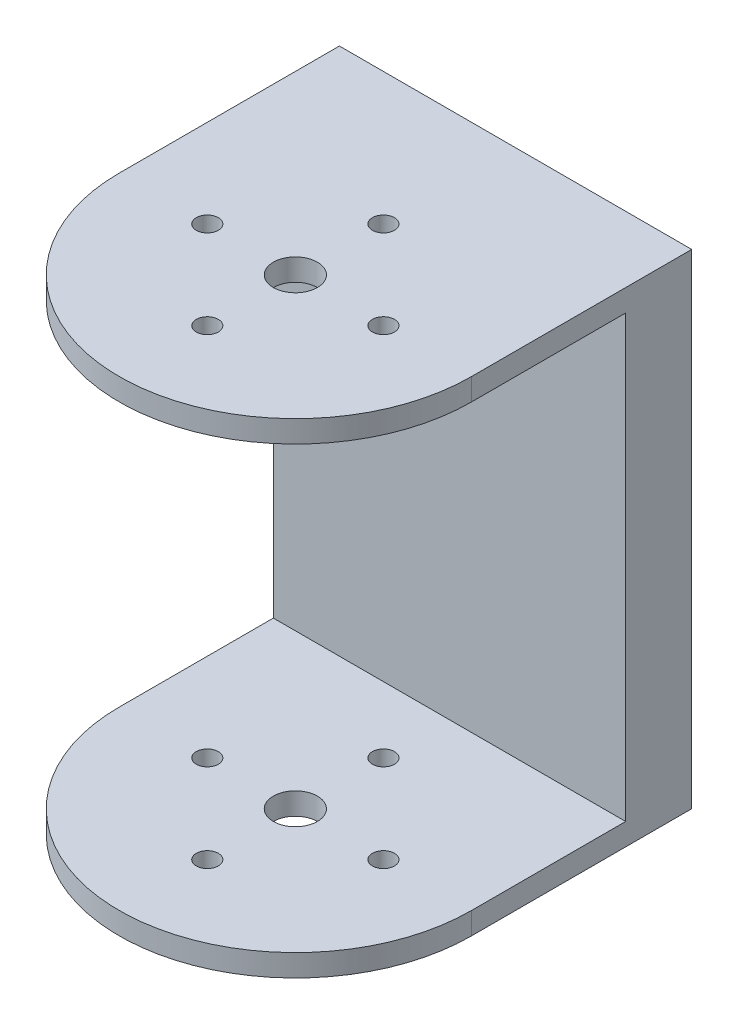
ISO-10303-21;
HEADER;
FILE_DESCRIPTION(('STEP AP214'),'2;1');
FILE_NAME('part.step','',(''),(''),'','','');
FILE_SCHEMA(('AUTOMOTIVE_DESIGN { 1 0 10303 214 1 1 1 1 }'));
ENDSEC;
DATA;
#1=APPLICATION_CONTEXT('core data for automotive mechanical design processes');
#2=APPLICATION_PROTOCOL_DEFINITION('international standard','automotive_design',2000,#1);
#3=PRODUCT_CONTEXT('',#1,'mechanical');
#4=PRODUCT('Part','Part','',(#3));
#5=PRODUCT_RELATED_PRODUCT_CATEGORY('part','',(#4));
#6=PRODUCT_DEFINITION_FORMATION('','',#4);
#7=PRODUCT_DEFINITION_CONTEXT('part definition',#1,'design');
#8=PRODUCT_DEFINITION('design','',#6,#7);
#9=PRODUCT_DEFINITION_SHAPE('','',#8);
#10=(LENGTH_UNIT() NAMED_UNIT(*) SI_UNIT(.MILLI.,.METRE.));
#11=(NAMED_UNIT(*) PLANE_ANGLE_UNIT() SI_UNIT($,.RADIAN.));
#12=(NAMED_UNIT(*) SI_UNIT($,.STERADIAN.) SOLID_ANGLE_UNIT());
#13=UNCERTAINTY_MEASURE_WITH_UNIT(LENGTH_MEASURE(1.E-05),#10,'distance_accuracy_value','');
#14=(GEOMETRIC_REPRESENTATION_CONTEXT(3) GLOBAL_UNCERTAINTY_ASSIGNED_CONTEXT((#13)) GLOBAL_UNIT_ASSIGNED_CONTEXT((#10,
#11,#12)) REPRESENTATION_CONTEXT('',''));
#15=CARTESIAN_POINT('',(0.,0.,0.));
#16=DIRECTION('',(0.,0.,1.));
#17=DIRECTION('',(1.,0.,0.));
#18=AXIS2_PLACEMENT_3D('',#15,#16,#17);
#19=CARTESIAN_POINT('',(2.25414240564596E-13,44.,0.));
#20=DIRECTION('',(0.,-1.,0.));
#21=DIRECTION('',(0.,0.,-1.));
#22=AXIS2_PLACEMENT_3D('',#19,#20,#21);
#23=CYLINDRICAL_SURFACE('',#22,16.);
#24=DIRECTION('',(0.,-1.,0.));
#25=VECTOR('',#24,1.);
#26=CARTESIAN_POINT('',(16.,44.,0.));
#27=LINE('',#26,#25);
#28=CARTESIAN_POINT('',(16.,1.99999999999999,0.));
#29=VERTEX_POINT('',#28);
#30=CARTESIAN_POINT('',(16.,0.,0.));
#31=VERTEX_POINT('',#30);
#32=EDGE_CURVE('E50',#29,#31,#27,.T.);
#33=ORIENTED_EDGE('',*,*,#32,.F.);
#34=CARTESIAN_POINT('',(2.25414240564596E-13,1.99999999999999,0.));
#35=DIRECTION('',(0.,-1.,0.));
#36=DIRECTION('',(0.,0.,-1.));
#37=AXIS2_PLACEMENT_3D('',#34,#35,#36);
#38=CIRCLE('',#37,16.);
#39=CARTESIAN_POINT('',(-16.,1.99999999999999,0.));
#40=VERTEX_POINT('',#39);
#41=EDGE_CURVE('E172',#29,#40,#38,.T.);
#42=ORIENTED_EDGE('',*,*,#41,.T.);
#43=DIRECTION('',(0.,-1.,0.));
#44=VECTOR('',#43,1.);
#45=CARTESIAN_POINT('',(-16.,44.,0.));
#46=LINE('',#45,#44);
#47=CARTESIAN_POINT('',(-16.,0.,0.));
#48=VERTEX_POINT('',#47);
#49=EDGE_CURVE('E89',#40,#48,#46,.T.);
#50=ORIENTED_EDGE('',*,*,#49,.T.);
#51=CARTESIAN_POINT('',(2.25414240564596E-13,0.,0.));
#52=DIRECTION('',(0.,1.,0.));
#53=DIRECTION('',(0.,0.,1.));
#54=AXIS2_PLACEMENT_3D('',#51,#52,#53);
#55=CIRCLE('',#54,16.);
#56=EDGE_CURVE('E202',#48,#31,#55,.T.);
#57=ORIENTED_EDGE('',*,*,#56,.T.);
#58=EDGE_LOOP('',(#33,#42,#50,#57));
#59=FACE_BOUND('',#58,.T.);
#60=ADVANCED_FACE('F41',(#59),#23,.T.);
#61=CARTESIAN_POINT('',(2.25414240564596E-13,44.,0.));
#62=DIRECTION('',(0.,-1.,0.));
#63=DIRECTION('',(0.,0.,-1.));
#64=AXIS2_PLACEMENT_3D('',#61,#62,#63);
#65=CYLINDRICAL_SURFACE('',#64,2.);
#66=CARTESIAN_POINT('',(2.25414240564596E-13,1.99999999999999,0.));
#67=DIRECTION('',(0.,-1.,0.));
#68=DIRECTION('',(0.,0.,-1.));
#69=AXIS2_PLACEMENT_3D('',#66,#67,#68);
#70=CIRCLE('',#69,2.);
#71=CARTESIAN_POINT('',(2.25414240564596E-13,1.99999999999999,-2.));
#72=VERTEX_POINT('',#71);
#73=EDGE_CURVE('E169',#72,#72,#70,.T.);
#74=ORIENTED_EDGE('',*,*,#73,.F.);
#75=EDGE_LOOP('',(#74));
#76=FACE_BOUND('',#75,.T.);
#77=CARTESIAN_POINT('',(2.25414240564596E-13,0.,0.));
#78=DIRECTION('',(0.,1.,0.));
#79=DIRECTION('',(0.,0.,1.));
#80=AXIS2_PLACEMENT_3D('',#77,#78,#79);
#81=CIRCLE('',#80,2.);
#82=CARTESIAN_POINT('',(2.25414240564596E-13,0.,2.));
#83=VERTEX_POINT('',#82);
#84=EDGE_CURVE('E196',#83,#83,#81,.T.);
#85=ORIENTED_EDGE('',*,*,#84,.F.);
#86=EDGE_LOOP('',(#85));
#87=FACE_BOUND('',#86,.T.);
#88=ADVANCED_FACE('F255',(#76,#87),#65,.F.);
#89=CARTESIAN_POINT('',(0.,44.,-8.));
#90=DIRECTION('',(0.,-1.,0.));
#91=DIRECTION('',(0.,0.,-1.));
#92=AXIS2_PLACEMENT_3D('',#89,#90,#91);
#93=CYLINDRICAL_SURFACE('',#92,1.);
#94=CARTESIAN_POINT('',(0.,1.99999999999999,-8.));
#95=DIRECTION('',(0.,-1.,0.));
#96=DIRECTION('',(0.,0.,-1.));
#97=AXIS2_PLACEMENT_3D('',#94,#95,#96);
#98=CIRCLE('',#97,1.);
#99=CARTESIAN_POINT('',(0.,1.99999999999999,-9.));
#100=VERTEX_POINT('',#99);
#101=EDGE_CURVE('E166',#100,#100,#98,.T.);
#102=ORIENTED_EDGE('',*,*,#101,.F.);
#103=EDGE_LOOP('',(#102));
#104=FACE_BOUND('',#103,.T.);
#105=CARTESIAN_POINT('',(0.,0.,-8.));
#106=DIRECTION('',(0.,1.,0.));
#107=DIRECTION('',(0.,0.,1.));
#108=AXIS2_PLACEMENT_3D('',#105,#106,#107);
#109=CIRCLE('',#108,1.);
#110=CARTESIAN_POINT('',(0.,0.,-7.));
#111=VERTEX_POINT('',#110);
#112=EDGE_CURVE('E190',#111,#111,#109,.T.);
#113=ORIENTED_EDGE('',*,*,#112,.F.);
#114=EDGE_LOOP('',(#113));
#115=FACE_BOUND('',#114,.T.);
#116=ADVANCED_FACE('F259',(#104,#115),#93,.F.);
#117=CARTESIAN_POINT('',(8.,44.,0.));
#118=DIRECTION('',(0.,-1.,0.));
#119=DIRECTION('',(0.,0.,-1.));
#120=AXIS2_PLACEMENT_3D('',#117,#118,#119);
#121=CYLINDRICAL_SURFACE('',#120,1.00000000000003);
#122=CARTESIAN_POINT('',(8.,1.99999999999999,0.));
#123=DIRECTION('',(0.,-1.,0.));
#124=DIRECTION('',(0.,0.,-1.));
#125=AXIS2_PLACEMENT_3D('',#122,#123,#124);
#126=CIRCLE('',#125,1.00000000000003);
#127=CARTESIAN_POINT('',(8.,1.99999999999999,-1.00000000000003));
#128=VERTEX_POINT('',#127);
#129=EDGE_CURVE('E163',#128,#128,#126,.T.);
#130=ORIENTED_EDGE('',*,*,#129,.F.);
#131=EDGE_LOOP('',(#130));
#132=FACE_BOUND('',#131,.T.);
#133=CARTESIAN_POINT('',(8.,0.,0.));
#134=DIRECTION('',(0.,1.,0.));
#135=DIRECTION('',(0.,0.,1.));
#136=AXIS2_PLACEMENT_3D('',#133,#134,#135);
#137=CIRCLE('',#136,1.00000000000003);
#138=CARTESIAN_POINT('',(8.,0.,1.00000000000003));
#139=VERTEX_POINT('',#138);
#140=EDGE_CURVE('E184',#139,#139,#137,.T.);
#141=ORIENTED_EDGE('',*,*,#140,.F.);
#142=EDGE_LOOP('',(#141));
#143=FACE_BOUND('',#142,.T.);
#144=ADVANCED_FACE('F292',(#132,#143),#121,.F.);
#145=CARTESIAN_POINT('',(0.,44.,8.));
#146=DIRECTION('',(0.,-1.,0.));
#147=DIRECTION('',(0.,0.,-1.));
#148=AXIS2_PLACEMENT_3D('',#145,#146,#147);
#149=CYLINDRICAL_SURFACE('',#148,1.00000000000005);
#150=CARTESIAN_POINT('',(0.,1.99999999999999,8.));
#151=DIRECTION('',(0.,-1.,0.));
#152=DIRECTION('',(0.,0.,-1.));
#153=AXIS2_PLACEMENT_3D('',#150,#151,#152);
#154=CIRCLE('',#153,1.00000000000005);
#155=CARTESIAN_POINT('',(0.,1.99999999999999,6.99999999999995));
#156=VERTEX_POINT('',#155);
#157=EDGE_CURVE('E160',#156,#156,#154,.T.);
#158=ORIENTED_EDGE('',*,*,#157,.F.);
#159=EDGE_LOOP('',(#158));
#160=FACE_BOUND('',#159,.T.);
#161=CARTESIAN_POINT('',(0.,0.,8.));
#162=DIRECTION('',(0.,1.,0.));
#163=DIRECTION('',(0.,0.,1.));
#164=AXIS2_PLACEMENT_3D('',#161,#162,#163);
#165=CIRCLE('',#164,1.00000000000005);
#166=CARTESIAN_POINT('',(0.,0.,9.00000000000006));
#167=VERTEX_POINT('',#166);
#168=EDGE_CURVE('E178',#167,#167,#165,.T.);
#169=ORIENTED_EDGE('',*,*,#168,.F.);
#170=EDGE_LOOP('',(#169));
#171=FACE_BOUND('',#170,.T.);
#172=ADVANCED_FACE('F249',(#160,#171),#149,.F.);
#173=CARTESIAN_POINT('',(-8.,44.,0.));
#174=DIRECTION('',(0.,-1.,0.));
#175=DIRECTION('',(0.,0.,-1.));
#176=AXIS2_PLACEMENT_3D('',#173,#174,#175);
#177=CYLINDRICAL_SURFACE('',#176,1.00000000000008);
#178=CARTESIAN_POINT('',(-8.,1.99999999999999,0.));
#179=DIRECTION('',(0.,-1.,0.));
#180=DIRECTION('',(0.,0.,-1.));
#181=AXIS2_PLACEMENT_3D('',#178,#179,#180);
#182=CIRCLE('',#181,1.00000000000008);
#183=CARTESIAN_POINT('',(-8.,1.99999999999999,-1.00000000000008));
#184=VERTEX_POINT('',#183);
#185=EDGE_CURVE('E45',#184,#184,#182,.T.);
#186=ORIENTED_EDGE('',*,*,#185,.F.);
#187=EDGE_LOOP('',(#186));
#188=FACE_BOUND('',#187,.T.);
#189=CARTESIAN_POINT('',(-8.,0.,0.));
#190=DIRECTION('',(0.,1.,0.));
#191=DIRECTION('',(0.,0.,1.));
#192=AXIS2_PLACEMENT_3D('',#189,#190,#191);
#193=CIRCLE('',#192,1.00000000000008);
#194=CARTESIAN_POINT('',(-8.,0.,1.00000000000008));
#195=VERTEX_POINT('',#194);
#196=EDGE_CURVE('E174',#195,#195,#193,.T.);
#197=ORIENTED_EDGE('',*,*,#196,.F.);
#198=EDGE_LOOP('',(#197));
#199=FACE_BOUND('',#198,.T.);
#200=ADVANCED_FACE('F235',(#188,#199),#177,.F.);
#201=CARTESIAN_POINT('',(2.25414240564596E-13,44.,0.));
#202=DIRECTION('',(0.,1.,0.));
#203=DIRECTION('',(0.,0.,1.));
#204=AXIS2_PLACEMENT_3D('',#201,#202,#203);
#205=PLANE('',#204);
#206=CARTESIAN_POINT('',(0.,44.,8.));
#207=DIRECTION('',(0.,1.,0.));
#208=DIRECTION('',(0.,0.,1.));
#209=AXIS2_PLACEMENT_3D('',#206,#207,#208);
#210=CIRCLE('',#209,1.00000000000005);
#211=CARTESIAN_POINT('',(0.,44.,9.00000000000006));
#212=VERTEX_POINT('',#211);
#213=EDGE_CURVE('E181',#212,#212,#210,.T.);
#214=ORIENTED_EDGE('',*,*,#213,.F.);
#215=EDGE_LOOP('',(#214));
#216=FACE_BOUND('',#215,.T.);
#217=CARTESIAN_POINT('',(0.,44.,-8.));
#218=DIRECTION('',(0.,1.,0.));
#219=DIRECTION('',(0.,0.,1.));
#220=AXIS2_PLACEMENT_3D('',#217,#218,#219);
#221=CIRCLE('',#220,1.);
#222=CARTESIAN_POINT('',(0.,44.,-7.));
#223=VERTEX_POINT('',#222);
#224=EDGE_CURVE('E193',#223,#223,#221,.T.);
#225=ORIENTED_EDGE('',*,*,#224,.F.);
#226=EDGE_LOOP('',(#225));
#227=FACE_BOUND('',#226,.T.);
#228=CARTESIAN_POINT('',(2.25414240564596E-13,44.,0.));
#229=DIRECTION('',(0.,1.,0.));
#230=DIRECTION('',(0.,0.,1.));
#231=AXIS2_PLACEMENT_3D('',#228,#229,#230);
#232=CIRCLE('',#231,16.);
#233=CARTESIAN_POINT('',(-16.,44.,0.));
#234=VERTEX_POINT('',#233);
#235=CARTESIAN_POINT('',(16.,44.,0.));
#236=VERTEX_POINT('',#235);
#237=EDGE_CURVE('E205',#234,#236,#232,.T.);
#238=ORIENTED_EDGE('',*,*,#237,.T.);
#239=DIRECTION('',(0.,0.,-1.));
#240=VECTOR('',#239,1.);
#241=CARTESIAN_POINT('',(16.,44.,-20.));
#242=LINE('',#241,#240);
#243=CARTESIAN_POINT('',(16.,44.,-20.));
#244=VERTEX_POINT('',#243);
#245=EDGE_CURVE('E96',#236,#244,#242,.T.);
#246=ORIENTED_EDGE('',*,*,#245,.T.);
#247=DIRECTION('',(-1.,0.,0.));
#248=VECTOR('',#247,1.);
#249=CARTESIAN_POINT('',(-16.,44.,-20.));
#250=LINE('',#249,#248);
#251=CARTESIAN_POINT('',(-16.,44.,-20.));
#252=VERTEX_POINT('',#251);
#253=EDGE_CURVE('E209',#244,#252,#250,.T.);
#254=ORIENTED_EDGE('',*,*,#253,.T.);
#255=DIRECTION('',(0.,0.,1.));
#256=VECTOR('',#255,1.);
#257=CARTESIAN_POINT('',(-16.,44.,0.));
#258=LINE('',#257,#256);
#259=EDGE_CURVE('E67',#252,#234,#258,.T.);
#260=ORIENTED_EDGE('',*,*,#259,.T.);
#261=EDGE_LOOP('',(#238,#246,#254,#260));
#262=FACE_BOUND('',#261,.T.);
#263=CARTESIAN_POINT('',(2.25414240564596E-13,44.,0.));
#264=DIRECTION('',(0.,1.,0.));
#265=DIRECTION('',(0.,0.,1.));
#266=AXIS2_PLACEMENT_3D('',#263,#264,#265);
#267=CIRCLE('',#266,2.);
#268=CARTESIAN_POINT('',(2.25414240564596E-13,44.,2.));
#269=VERTEX_POINT('',#268);
#270=EDGE_CURVE('E199',#269,#269,#267,.T.);
#271=ORIENTED_EDGE('',*,*,#270,.F.);
#272=EDGE_LOOP('',(#271));
#273=FACE_BOUND('',#272,.T.);
#274=CARTESIAN_POINT('',(8.,44.,0.));
#275=DIRECTION('',(0.,1.,0.));
#276=DIRECTION('',(0.,0.,1.));
#277=AXIS2_PLACEMENT_3D('',#274,#275,#276);
#278=CIRCLE('',#277,1.00000000000003);
#279=CARTESIAN_POINT('',(8.,44.,1.00000000000003));
#280=VERTEX_POINT('',#279);
#281=EDGE_CURVE('E187',#280,#280,#278,.T.);
#282=ORIENTED_EDGE('',*,*,#281,.F.);
#283=EDGE_LOOP('',(#282));
#284=FACE_BOUND('',#283,.T.);
#285=CARTESIAN_POINT('',(-8.,44.,0.));
#286=DIRECTION('',(0.,1.,0.));
#287=DIRECTION('',(0.,0.,1.));
#288=AXIS2_PLACEMENT_3D('',#285,#286,#287);
#289=CIRCLE('',#288,1.00000000000008);
#290=CARTESIAN_POINT('',(-8.,44.,1.00000000000008));
#291=VERTEX_POINT('',#290);
#292=EDGE_CURVE('E175',#291,#291,#289,.T.);
#293=ORIENTED_EDGE('',*,*,#292,.F.);
#294=EDGE_LOOP('',(#293));
#295=FACE_BOUND('',#294,.T.);
#296=ADVANCED_FACE('F238',(#216,#227,#262,#273,#284,#295),#205,.T.);
#297=CARTESIAN_POINT('',(2.25414240564596E-13,0.,0.));
#298=DIRECTION('',(0.,1.,0.));
#299=DIRECTION('',(0.,0.,1.));
#300=AXIS2_PLACEMENT_3D('',#297,#298,#299);
#301=PLANE('',#300);
#302=ORIENTED_EDGE('',*,*,#56,.F.);
#303=DIRECTION('',(0.,0.,1.));
#304=VECTOR('',#303,1.);
#305=CARTESIAN_POINT('',(-16.,0.,0.));
#306=LINE('',#305,#304);
#307=CARTESIAN_POINT('',(-16.,0.,-20.));
#308=VERTEX_POINT('',#307);
#309=EDGE_CURVE('E207',#308,#48,#306,.T.);
#310=ORIENTED_EDGE('',*,*,#309,.F.);
#311=DIRECTION('',(-1.,0.,0.));
#312=VECTOR('',#311,1.);
#313=CARTESIAN_POINT('',(-16.,0.,-20.));
#314=LINE('',#313,#312);
#315=CARTESIAN_POINT('',(16.,0.,-20.));
#316=VERTEX_POINT('',#315);
#317=EDGE_CURVE('E215',#316,#308,#314,.T.);
#318=ORIENTED_EDGE('',*,*,#317,.F.);
#319=DIRECTION('',(0.,0.,-1.));
#320=VECTOR('',#319,1.);
#321=CARTESIAN_POINT('',(16.,0.,-20.));
#322=LINE('',#321,#320);
#323=EDGE_CURVE('E213',#31,#316,#322,.T.);
#324=ORIENTED_EDGE('',*,*,#323,.F.);
#325=EDGE_LOOP('',(#302,#310,#318,#324));
#326=FACE_BOUND('',#325,.T.);
#327=ORIENTED_EDGE('',*,*,#84,.T.);
#328=EDGE_LOOP('',(#327));
#329=FACE_BOUND('',#328,.T.);
#330=ORIENTED_EDGE('',*,*,#112,.T.);
#331=EDGE_LOOP('',(#330));
#332=FACE_BOUND('',#331,.T.);
#333=ORIENTED_EDGE('',*,*,#140,.T.);
#334=EDGE_LOOP('',(#333));
#335=FACE_BOUND('',#334,.T.);
#336=ORIENTED_EDGE('',*,*,#168,.T.);
#337=EDGE_LOOP('',(#336));
#338=FACE_BOUND('',#337,.T.);
#339=ORIENTED_EDGE('',*,*,#196,.T.);
#340=EDGE_LOOP('',(#339));
#341=FACE_BOUND('',#340,.T.);
#342=ADVANCED_FACE('F240',(#326,#329,#332,#335,#338,#341),#301,.F.);
#343=CARTESIAN_POINT('',(2.25414240564596E-13,42.,0.));
#344=DIRECTION('',(0.,1.,0.));
#345=DIRECTION('',(0.,0.,1.));
#346=AXIS2_PLACEMENT_3D('',#343,#344,#345);
#347=CIRCLE('',#346,16.);
#348=CARTESIAN_POINT('',(-16.,42.,0.));
#349=VERTEX_POINT('',#348);
#350=CARTESIAN_POINT('',(16.,42.,0.));
#351=VERTEX_POINT('',#350);
#352=EDGE_CURVE('E58',#349,#351,#347,.T.);
#353=ORIENTED_EDGE('',*,*,#352,.T.);
#354=EDGE_CURVE('E11',#236,#351,#27,.T.);
#355=ORIENTED_EDGE('',*,*,#354,.F.);
#356=ORIENTED_EDGE('',*,*,#237,.F.);
#357=EDGE_CURVE('E218',#234,#349,#46,.T.);
#358=ORIENTED_EDGE('',*,*,#357,.T.);
#359=EDGE_LOOP('',(#353,#355,#356,#358));
#360=FACE_BOUND('',#359,.T.);
#361=ADVANCED_FACE('F43',(#360),#23,.T.);
#362=CARTESIAN_POINT('',(16.,44.,-20.));
#363=DIRECTION('',(-1.,0.,0.));
#364=DIRECTION('',(0.,0.,1.));
#365=AXIS2_PLACEMENT_3D('',#362,#363,#364);
#366=PLANE('',#365);
#367=DIRECTION('',(0.,1.,0.));
#368=VECTOR('',#367,1.);
#369=CARTESIAN_POINT('',(16.,42.,-14.));
#370=LINE('',#369,#368);
#371=CARTESIAN_POINT('',(16.,1.99999999999999,-14.));
#372=VERTEX_POINT('',#371);
#373=CARTESIAN_POINT('',(16.,42.,-14.));
#374=VERTEX_POINT('',#373);
#375=EDGE_CURVE('E125',#372,#374,#370,.T.);
#376=ORIENTED_EDGE('',*,*,#375,.F.);
#377=DIRECTION('',(0.,0.,-1.));
#378=VECTOR('',#377,1.);
#379=CARTESIAN_POINT('',(16.,1.99999999999999,16.));
#380=LINE('',#379,#378);
#381=EDGE_CURVE('E137',#29,#372,#380,.T.);
#382=ORIENTED_EDGE('',*,*,#381,.F.);
#383=ORIENTED_EDGE('',*,*,#32,.T.);
#384=ORIENTED_EDGE('',*,*,#323,.T.);
#385=DIRECTION('',(0.,-1.,0.));
#386=VECTOR('',#385,1.);
#387=CARTESIAN_POINT('',(16.,44.,-20.));
#388=LINE('',#387,#386);
#389=EDGE_CURVE('E223',#244,#316,#388,.T.);
#390=ORIENTED_EDGE('',*,*,#389,.F.);
#391=ORIENTED_EDGE('',*,*,#245,.F.);
#392=ORIENTED_EDGE('',*,*,#354,.T.);
#393=DIRECTION('',(0.,0.,1.));
#394=VECTOR('',#393,1.);
#395=CARTESIAN_POINT('',(16.,42.,16.));
#396=LINE('',#395,#394);
#397=EDGE_CURVE('E139',#374,#351,#396,.T.);
#398=ORIENTED_EDGE('',*,*,#397,.F.);
#399=EDGE_LOOP('',(#376,#382,#383,#384,#390,#391,#392,#398));
#400=FACE_BOUND('',#399,.T.);
#401=ADVANCED_FACE('F264',(#400),#366,.F.);
#402=CARTESIAN_POINT('',(-16.,44.,-20.));
#403=DIRECTION('',(0.,0.,1.));
#404=DIRECTION('',(1.,0.,0.));
#405=AXIS2_PLACEMENT_3D('',#402,#403,#404);
#406=PLANE('',#405);
#407=ORIENTED_EDGE('',*,*,#317,.T.);
#408=DIRECTION('',(0.,-1.,0.));
#409=VECTOR('',#408,1.);
#410=CARTESIAN_POINT('',(-16.,44.,-20.));
#411=LINE('',#410,#409);
#412=EDGE_CURVE('E220',#252,#308,#411,.T.);
#413=ORIENTED_EDGE('',*,*,#412,.F.);
#414=ORIENTED_EDGE('',*,*,#253,.F.);
#415=ORIENTED_EDGE('',*,*,#389,.T.);
#416=EDGE_LOOP('',(#407,#413,#414,#415));
#417=FACE_BOUND('',#416,.T.);
#418=ADVANCED_FACE('F269',(#417),#406,.F.);
#419=CARTESIAN_POINT('',(-16.,44.,0.));
#420=DIRECTION('',(1.,0.,0.));
#421=DIRECTION('',(0.,0.,-1.));
#422=AXIS2_PLACEMENT_3D('',#419,#420,#421);
#423=PLANE('',#422);
#424=ORIENTED_EDGE('',*,*,#49,.F.);
#425=DIRECTION('',(0.,0.,-1.));
#426=VECTOR('',#425,1.);
#427=CARTESIAN_POINT('',(-16.,1.99999999999999,16.));
#428=LINE('',#427,#426);
#429=CARTESIAN_POINT('',(-16.,1.99999999999999,-14.));
#430=VERTEX_POINT('',#429);
#431=EDGE_CURVE('E128',#40,#430,#428,.T.);
#432=ORIENTED_EDGE('',*,*,#431,.T.);
#433=DIRECTION('',(0.,1.,0.));
#434=VECTOR('',#433,1.);
#435=CARTESIAN_POINT('',(-16.,42.,-14.));
#436=LINE('',#435,#434);
#437=CARTESIAN_POINT('',(-16.,42.,-14.));
#438=VERTEX_POINT('',#437);
#439=EDGE_CURVE('E122',#430,#438,#436,.T.);
#440=ORIENTED_EDGE('',*,*,#439,.T.);
#441=DIRECTION('',(0.,0.,1.));
#442=VECTOR('',#441,1.);
#443=CARTESIAN_POINT('',(-16.,42.,16.));
#444=LINE('',#443,#442);
#445=EDGE_CURVE('E130',#438,#349,#444,.T.);
#446=ORIENTED_EDGE('',*,*,#445,.T.);
#447=ORIENTED_EDGE('',*,*,#357,.F.);
#448=ORIENTED_EDGE('',*,*,#259,.F.);
#449=ORIENTED_EDGE('',*,*,#412,.T.);
#450=ORIENTED_EDGE('',*,*,#309,.T.);
#451=EDGE_LOOP('',(#424,#432,#440,#446,#447,#448,#449,#450));
#452=FACE_BOUND('',#451,.T.);
#453=ADVANCED_FACE('F135',(#452),#423,.F.);
#454=CARTESIAN_POINT('',(2.25414240564596E-13,42.,0.));
#455=DIRECTION('',(0.,1.,0.));
#456=DIRECTION('',(0.,0.,1.));
#457=AXIS2_PLACEMENT_3D('',#454,#455,#456);
#458=CIRCLE('',#457,2.);
#459=CARTESIAN_POINT('',(2.25414240564596E-13,42.,2.));
#460=VERTEX_POINT('',#459);
#461=EDGE_CURVE('E156',#460,#460,#458,.T.);
#462=ORIENTED_EDGE('',*,*,#461,.F.);
#463=EDGE_LOOP('',(#462));
#464=FACE_BOUND('',#463,.T.);
#465=ORIENTED_EDGE('',*,*,#270,.T.);
#466=EDGE_LOOP('',(#465));
#467=FACE_BOUND('',#466,.T.);
#468=ADVANCED_FACE('F261',(#464,#467),#65,.F.);
#469=CARTESIAN_POINT('',(0.,42.,-8.));
#470=DIRECTION('',(0.,1.,0.));
#471=DIRECTION('',(0.,0.,1.));
#472=AXIS2_PLACEMENT_3D('',#469,#470,#471);
#473=CIRCLE('',#472,1.);
#474=CARTESIAN_POINT('',(0.,42.,-7.));
#475=VERTEX_POINT('',#474);
#476=EDGE_CURVE('E153',#475,#475,#473,.T.);
#477=ORIENTED_EDGE('',*,*,#476,.F.);
#478=EDGE_LOOP('',(#477));
#479=FACE_BOUND('',#478,.T.);
#480=ORIENTED_EDGE('',*,*,#224,.T.);
#481=EDGE_LOOP('',(#480));
#482=FACE_BOUND('',#481,.T.);
#483=ADVANCED_FACE('F289',(#479,#482),#93,.F.);
#484=CARTESIAN_POINT('',(8.,42.,0.));
#485=DIRECTION('',(0.,1.,0.));
#486=DIRECTION('',(0.,0.,1.));
#487=AXIS2_PLACEMENT_3D('',#484,#485,#486);
#488=CIRCLE('',#487,1.00000000000003);
#489=CARTESIAN_POINT('',(8.,42.,1.00000000000003));
#490=VERTEX_POINT('',#489);
#491=EDGE_CURVE('E150',#490,#490,#488,.T.);
#492=ORIENTED_EDGE('',*,*,#491,.F.);
#493=EDGE_LOOP('',(#492));
#494=FACE_BOUND('',#493,.T.);
#495=ORIENTED_EDGE('',*,*,#281,.T.);
#496=EDGE_LOOP('',(#495));
#497=FACE_BOUND('',#496,.T.);
#498=ADVANCED_FACE('F287',(#494,#497),#121,.F.);
#499=CARTESIAN_POINT('',(0.,42.,8.));
#500=DIRECTION('',(0.,1.,0.));
#501=DIRECTION('',(0.,0.,1.));
#502=AXIS2_PLACEMENT_3D('',#499,#500,#501);
#503=CIRCLE('',#502,1.00000000000005);
#504=CARTESIAN_POINT('',(0.,42.,9.00000000000006));
#505=VERTEX_POINT('',#504);
#506=EDGE_CURVE('E147',#505,#505,#503,.T.);
#507=ORIENTED_EDGE('',*,*,#506,.F.);
#508=EDGE_LOOP('',(#507));
#509=FACE_BOUND('',#508,.T.);
#510=ORIENTED_EDGE('',*,*,#213,.T.);
#511=EDGE_LOOP('',(#510));
#512=FACE_BOUND('',#511,.T.);
#513=ADVANCED_FACE('F233',(#509,#512),#149,.F.);
#514=CARTESIAN_POINT('',(-8.,42.,0.));
#515=DIRECTION('',(0.,1.,0.));
#516=DIRECTION('',(0.,0.,1.));
#517=AXIS2_PLACEMENT_3D('',#514,#515,#516);
#518=CIRCLE('',#517,1.00000000000008);
#519=CARTESIAN_POINT('',(-8.,42.,1.00000000000008));
#520=VERTEX_POINT('',#519);
#521=EDGE_CURVE('E145',#520,#520,#518,.T.);
#522=ORIENTED_EDGE('',*,*,#521,.F.);
#523=EDGE_LOOP('',(#522));
#524=FACE_BOUND('',#523,.T.);
#525=ORIENTED_EDGE('',*,*,#292,.T.);
#526=EDGE_LOOP('',(#525));
#527=FACE_BOUND('',#526,.T.);
#528=ADVANCED_FACE('F229',(#524,#527),#177,.F.);
#529=CARTESIAN_POINT('',(-16.,1.99999999999999,16.));
#530=DIRECTION('',(0.,-1.,0.));
#531=DIRECTION('',(0.,0.,-1.));
#532=AXIS2_PLACEMENT_3D('',#529,#530,#531);
#533=PLANE('',#532);
#534=ORIENTED_EDGE('',*,*,#73,.T.);
#535=EDGE_LOOP('',(#534));
#536=FACE_BOUND('',#535,.T.);
#537=ORIENTED_EDGE('',*,*,#101,.T.);
#538=EDGE_LOOP('',(#537));
#539=FACE_BOUND('',#538,.T.);
#540=ORIENTED_EDGE('',*,*,#129,.T.);
#541=EDGE_LOOP('',(#540));
#542=FACE_BOUND('',#541,.T.);
#543=ORIENTED_EDGE('',*,*,#157,.T.);
#544=EDGE_LOOP('',(#543));
#545=FACE_BOUND('',#544,.T.);
#546=ORIENTED_EDGE('',*,*,#185,.T.);
#547=EDGE_LOOP('',(#546));
#548=FACE_BOUND('',#547,.T.);
#549=ORIENTED_EDGE('',*,*,#381,.T.);
#550=DIRECTION('',(1.,0.,0.));
#551=VECTOR('',#550,1.);
#552=CARTESIAN_POINT('',(-16.,1.99999999999999,-14.));
#553=LINE('',#552,#551);
#554=EDGE_CURVE('E127',#430,#372,#553,.T.);
#555=ORIENTED_EDGE('',*,*,#554,.F.);
#556=ORIENTED_EDGE('',*,*,#431,.F.);
#557=ORIENTED_EDGE('',*,*,#41,.F.);
#558=EDGE_LOOP('',(#549,#555,#556,#557));
#559=FACE_BOUND('',#558,.T.);
#560=ADVANCED_FACE('F232',(#536,#539,#542,#545,#548,#559),#533,.F.);
#561=CARTESIAN_POINT('',(-16.,42.,16.));
#562=DIRECTION('',(0.,1.,0.));
#563=DIRECTION('',(0.,0.,1.));
#564=AXIS2_PLACEMENT_3D('',#561,#562,#563);
#565=PLANE('',#564);
#566=ORIENTED_EDGE('',*,*,#461,.T.);
#567=EDGE_LOOP('',(#566));
#568=FACE_BOUND('',#567,.T.);
#569=ORIENTED_EDGE('',*,*,#476,.T.);
#570=EDGE_LOOP('',(#569));
#571=FACE_BOUND('',#570,.T.);
#572=ORIENTED_EDGE('',*,*,#491,.T.);
#573=EDGE_LOOP('',(#572));
#574=FACE_BOUND('',#573,.T.);
#575=ORIENTED_EDGE('',*,*,#506,.T.);
#576=EDGE_LOOP('',(#575));
#577=FACE_BOUND('',#576,.T.);
#578=ORIENTED_EDGE('',*,*,#521,.T.);
#579=EDGE_LOOP('',(#578));
#580=FACE_BOUND('',#579,.T.);
#581=ORIENTED_EDGE('',*,*,#352,.F.);
#582=ORIENTED_EDGE('',*,*,#445,.F.);
#583=DIRECTION('',(1.,0.,0.));
#584=VECTOR('',#583,1.);
#585=CARTESIAN_POINT('',(-16.,42.,-14.));
#586=LINE('',#585,#584);
#587=EDGE_CURVE('E118',#438,#374,#586,.T.);
#588=ORIENTED_EDGE('',*,*,#587,.T.);
#589=ORIENTED_EDGE('',*,*,#397,.T.);
#590=EDGE_LOOP('',(#581,#582,#588,#589));
#591=FACE_BOUND('',#590,.T.);
#592=ADVANCED_FACE('F131',(#568,#571,#574,#577,#580,#591),#565,.F.);
#593=CARTESIAN_POINT('',(-16.,42.,-14.));
#594=DIRECTION('',(0.,0.,-1.));
#595=DIRECTION('',(-1.,0.,0.));
#596=AXIS2_PLACEMENT_3D('',#593,#594,#595);
#597=PLANE('',#596);
#598=ORIENTED_EDGE('',*,*,#375,.T.);
#599=ORIENTED_EDGE('',*,*,#587,.F.);
#600=ORIENTED_EDGE('',*,*,#439,.F.);
#601=ORIENTED_EDGE('',*,*,#554,.T.);
#602=EDGE_LOOP('',(#598,#599,#600,#601));
#603=FACE_BOUND('',#602,.T.);
#604=ADVANCED_FACE('F119',(#603),#597,.F.);
#605=CLOSED_SHELL('',(#60,#88,#116,#144,#172,#200,#296,#342,#361,#401,#418,#453,#468,#483,#498,
#513,#528,#560,#592,#604));
#606=MANIFOLD_SOLID_BREP('B2',#605);
#607=ADVANCED_BREP_SHAPE_REPRESENTATION('',(#18,#606),#14);
#608=SHAPE_DEFINITION_REPRESENTATION(#9,#607);
ENDSEC;
END-ISO-10303-21;
